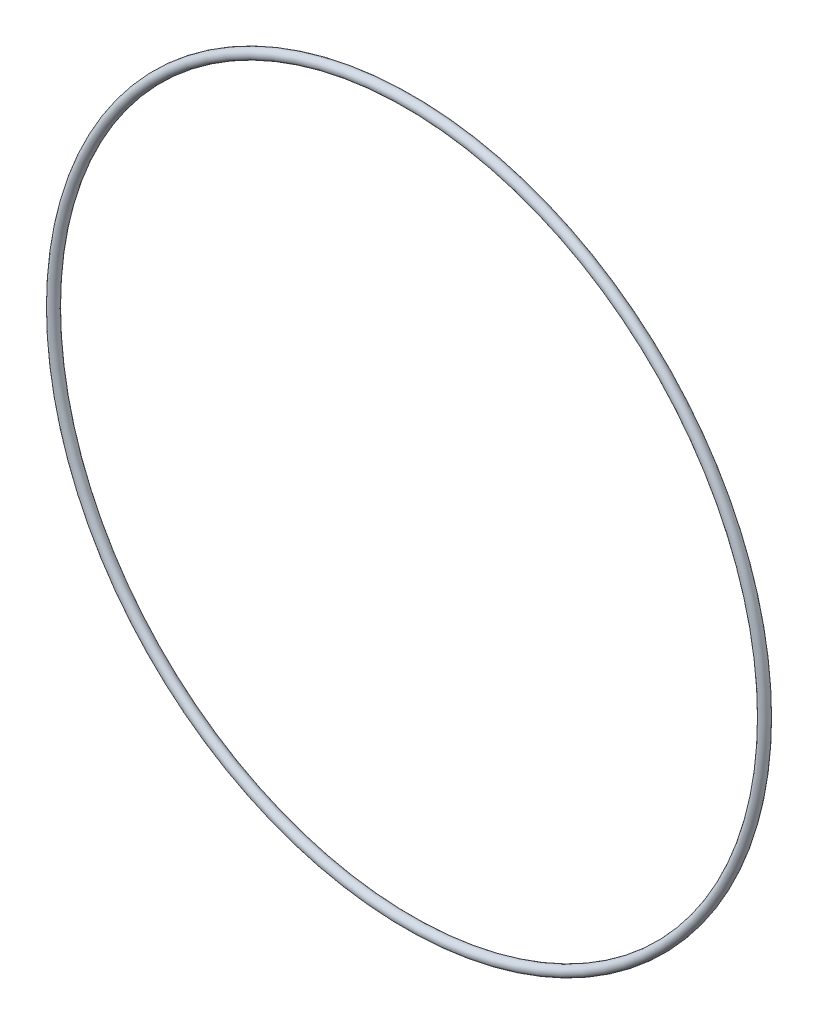
ISO-10303-21;
HEADER;
FILE_DESCRIPTION(('STEP AP214'),'2;1');
FILE_NAME('part.step','',(''),(''),'','','');
FILE_SCHEMA(('AUTOMOTIVE_DESIGN { 1 0 10303 214 1 1 1 1 }'));
ENDSEC;
DATA;
#1=APPLICATION_CONTEXT('core data for automotive mechanical design processes');
#2=APPLICATION_PROTOCOL_DEFINITION('international standard','automotive_design',2000,#1);
#3=PRODUCT_CONTEXT('',#1,'mechanical');
#4=PRODUCT('Part','Part','',(#3));
#5=PRODUCT_RELATED_PRODUCT_CATEGORY('part','',(#4));
#6=PRODUCT_DEFINITION_FORMATION('','',#4);
#7=PRODUCT_DEFINITION_CONTEXT('part definition',#1,'design');
#8=PRODUCT_DEFINITION('design','',#6,#7);
#9=PRODUCT_DEFINITION_SHAPE('','',#8);
#10=(LENGTH_UNIT() NAMED_UNIT(*) SI_UNIT(.MILLI.,.METRE.));
#11=(NAMED_UNIT(*) PLANE_ANGLE_UNIT() SI_UNIT($,.RADIAN.));
#12=(NAMED_UNIT(*) SI_UNIT($,.STERADIAN.) SOLID_ANGLE_UNIT());
#13=UNCERTAINTY_MEASURE_WITH_UNIT(LENGTH_MEASURE(1.E-05),#10,'distance_accuracy_value','');
#14=(GEOMETRIC_REPRESENTATION_CONTEXT(3) GLOBAL_UNCERTAINTY_ASSIGNED_CONTEXT((#13)) GLOBAL_UNIT_ASSIGNED_CONTEXT((#10,
#11,#12)) REPRESENTATION_CONTEXT('',''));
#15=CARTESIAN_POINT('',(0.,0.,0.));
#16=DIRECTION('',(0.,0.,1.));
#17=DIRECTION('',(1.,0.,0.));
#18=AXIS2_PLACEMENT_3D('',#15,#16,#17);
#19=CARTESIAN_POINT('',(0.,0.,0.));
#20=DIRECTION('',(0.,0.,1.));
#21=DIRECTION('',(1.,0.,0.));
#22=AXIS2_PLACEMENT_3D('',#19,#20,#21);
#23=TOROIDAL_SURFACE('',#22,58.,0.812800000000002);
#24=CARTESIAN_POINT('',(58.,0.,0.));
#25=DIRECTION('',(0.,1.,0.));
#26=DIRECTION('',(-1.,0.,0.));
#27=AXIS2_PLACEMENT_3D('',#24,#25,#26);
#28=CIRCLE('',#27,0.812800000000002);
#29=CARTESIAN_POINT('',(58.8128,0.,0.));
#30=VERTEX_POINT('',#29);
#31=EDGE_CURVE('E11',#30,#30,#28,.T.);
#32=CARTESIAN_POINT('',(0.,0.,0.));
#33=DIRECTION('',(0.,0.,1.));
#34=DIRECTION('',(1.,0.,0.));
#35=AXIS2_PLACEMENT_3D('',#32,#33,#34);
#36=CIRCLE('',#35,58.8128);
#37=EDGE_CURVE('',#30,#30,#36,.T.);
#38=ORIENTED_EDGE('',*,*,#31,.T.);
#39=ORIENTED_EDGE('',*,*,#31,.F.);
#40=ORIENTED_EDGE('',*,*,#37,.T.);
#41=ORIENTED_EDGE('',*,*,#37,.F.);
#42=EDGE_LOOP('',(#38,#40,#39,#41));
#43=FACE_BOUND('',#42,.T.);
#44=ADVANCED_FACE('F43',(#43),#23,.T.);
#45=CLOSED_SHELL('',(#44));
#46=MANIFOLD_SOLID_BREP('B2',#45);
#47=ADVANCED_BREP_SHAPE_REPRESENTATION('',(#18,#46),#14);
#48=SHAPE_DEFINITION_REPRESENTATION(#9,#47);
ENDSEC;
END-ISO-10303-21;
